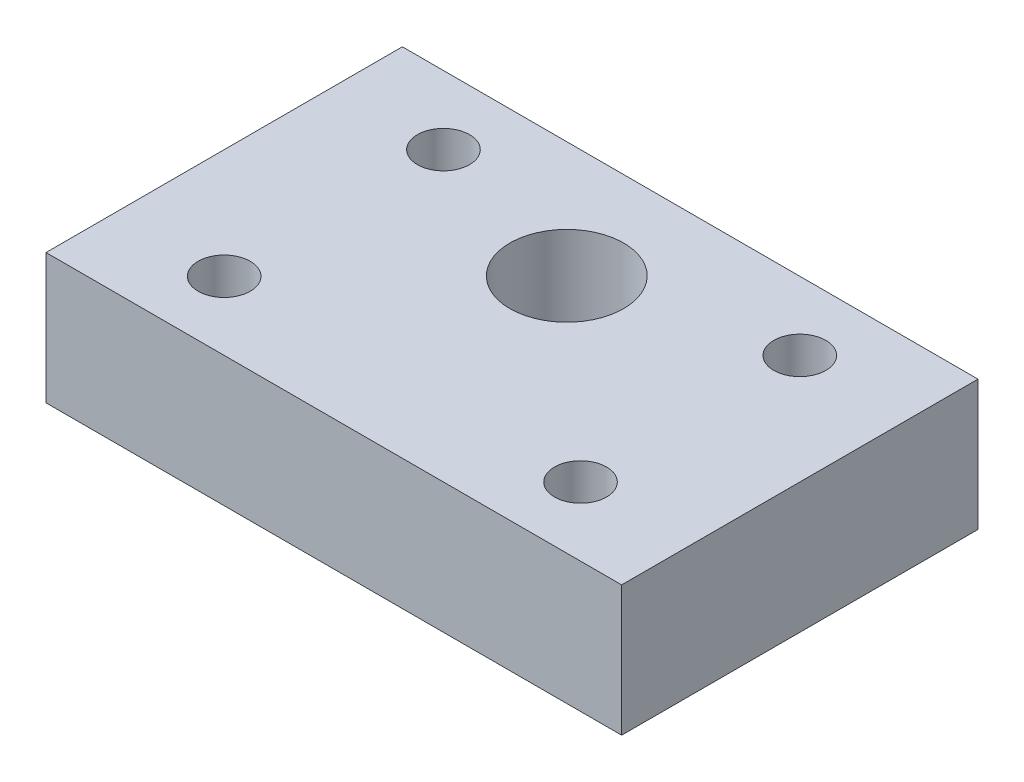
ISO-10303-21;
HEADER;
FILE_DESCRIPTION(('STEP AP214'),'2;1');
FILE_NAME('part.step','',(''),(''),'','','');
FILE_SCHEMA(('AUTOMOTIVE_DESIGN { 1 0 10303 214 1 1 1 1 }'));
ENDSEC;
DATA;
#1=APPLICATION_CONTEXT('core data for automotive mechanical design processes');
#2=APPLICATION_PROTOCOL_DEFINITION('international standard','automotive_design',2000,#1);
#3=PRODUCT_CONTEXT('',#1,'mechanical');
#4=PRODUCT('Part','Part','',(#3));
#5=PRODUCT_RELATED_PRODUCT_CATEGORY('part','',(#4));
#6=PRODUCT_DEFINITION_FORMATION('','',#4);
#7=PRODUCT_DEFINITION_CONTEXT('part definition',#1,'design');
#8=PRODUCT_DEFINITION('design','',#6,#7);
#9=PRODUCT_DEFINITION_SHAPE('','',#8);
#10=(LENGTH_UNIT() NAMED_UNIT(*) SI_UNIT(.MILLI.,.METRE.));
#11=(NAMED_UNIT(*) PLANE_ANGLE_UNIT() SI_UNIT($,.RADIAN.));
#12=(NAMED_UNIT(*) SI_UNIT($,.STERADIAN.) SOLID_ANGLE_UNIT());
#13=UNCERTAINTY_MEASURE_WITH_UNIT(LENGTH_MEASURE(1.E-05),#10,'distance_accuracy_value','');
#14=(GEOMETRIC_REPRESENTATION_CONTEXT(3) GLOBAL_UNCERTAINTY_ASSIGNED_CONTEXT((#13)) GLOBAL_UNIT_ASSIGNED_CONTEXT((#10,
#11,#12)) REPRESENTATION_CONTEXT('',''));
#15=CARTESIAN_POINT('',(0.,0.,0.));
#16=DIRECTION('',(0.,0.,1.));
#17=DIRECTION('',(1.,0.,0.));
#18=AXIS2_PLACEMENT_3D('',#15,#16,#17);
#19=CARTESIAN_POINT('',(0.,9.5,0.));
#20=DIRECTION('',(1.,0.,0.));
#21=DIRECTION('',(0.,0.,-1.));
#22=AXIS2_PLACEMENT_3D('',#19,#20,#21);
#23=PLANE('',#22);
#24=DIRECTION('',(0.,0.,1.));
#25=VECTOR('',#24,1.);
#26=CARTESIAN_POINT('',(0.,0.,0.));
#27=LINE('',#26,#25);
#28=CARTESIAN_POINT('',(0.,0.,0.));
#29=VERTEX_POINT('',#28);
#30=CARTESIAN_POINT('',(0.,0.,26.));
#31=VERTEX_POINT('',#30);
#32=EDGE_CURVE('E99',#29,#31,#27,.T.);
#33=ORIENTED_EDGE('',*,*,#32,.T.);
#34=DIRECTION('',(0.,-1.,0.));
#35=VECTOR('',#34,1.);
#36=CARTESIAN_POINT('',(0.,9.5,26.));
#37=LINE('',#36,#35);
#38=CARTESIAN_POINT('',(0.,9.5,26.));
#39=VERTEX_POINT('',#38);
#40=EDGE_CURVE('E11',#39,#31,#37,.T.);
#41=ORIENTED_EDGE('',*,*,#40,.F.);
#42=DIRECTION('',(0.,0.,1.));
#43=VECTOR('',#42,1.);
#44=CARTESIAN_POINT('',(0.,9.5,0.));
#45=LINE('',#44,#43);
#46=CARTESIAN_POINT('',(0.,9.5,0.));
#47=VERTEX_POINT('',#46);
#48=EDGE_CURVE('E87',#47,#39,#45,.T.);
#49=ORIENTED_EDGE('',*,*,#48,.F.);
#50=DIRECTION('',(0.,-1.,0.));
#51=VECTOR('',#50,1.);
#52=CARTESIAN_POINT('',(0.,9.5,0.));
#53=LINE('',#52,#51);
#54=EDGE_CURVE('E95',#47,#29,#53,.T.);
#55=ORIENTED_EDGE('',*,*,#54,.T.);
#56=EDGE_LOOP('',(#33,#41,#49,#55));
#57=FACE_BOUND('',#56,.T.);
#58=ADVANCED_FACE('F36',(#57),#23,.F.);
#59=CARTESIAN_POINT('',(0.,9.5,26.));
#60=DIRECTION('',(0.,0.,-1.));
#61=DIRECTION('',(-1.,0.,0.));
#62=AXIS2_PLACEMENT_3D('',#59,#60,#61);
#63=PLANE('',#62);
#64=DIRECTION('',(1.,0.,0.));
#65=VECTOR('',#64,1.);
#66=CARTESIAN_POINT('',(0.,0.,26.));
#67=LINE('',#66,#65);
#68=CARTESIAN_POINT('',(42.,0.,26.));
#69=VERTEX_POINT('',#68);
#70=EDGE_CURVE('E91',#31,#69,#67,.T.);
#71=ORIENTED_EDGE('',*,*,#70,.T.);
#72=DIRECTION('',(0.,-1.,0.));
#73=VECTOR('',#72,1.);
#74=CARTESIAN_POINT('',(42.,9.5,26.));
#75=LINE('',#74,#73);
#76=CARTESIAN_POINT('',(42.,9.5,26.));
#77=VERTEX_POINT('',#76);
#78=EDGE_CURVE('E44',#77,#69,#75,.T.);
#79=ORIENTED_EDGE('',*,*,#78,.F.);
#80=DIRECTION('',(1.,0.,0.));
#81=VECTOR('',#80,1.);
#82=CARTESIAN_POINT('',(0.,9.5,26.));
#83=LINE('',#82,#81);
#84=EDGE_CURVE('E82',#39,#77,#83,.T.);
#85=ORIENTED_EDGE('',*,*,#84,.F.);
#86=ORIENTED_EDGE('',*,*,#40,.T.);
#87=EDGE_LOOP('',(#71,#79,#85,#86));
#88=FACE_BOUND('',#87,.T.);
#89=ADVANCED_FACE('F90',(#88),#63,.F.);
#90=CARTESIAN_POINT('',(42.,9.5,0.));
#91=DIRECTION('',(-1.,0.,0.));
#92=DIRECTION('',(0.,0.,1.));
#93=AXIS2_PLACEMENT_3D('',#90,#91,#92);
#94=PLANE('',#93);
#95=DIRECTION('',(0.,0.,-1.));
#96=VECTOR('',#95,1.);
#97=CARTESIAN_POINT('',(42.,0.,0.));
#98=LINE('',#97,#96);
#99=CARTESIAN_POINT('',(42.,0.,0.));
#100=VERTEX_POINT('',#99);
#101=EDGE_CURVE('E69',#69,#100,#98,.T.);
#102=ORIENTED_EDGE('',*,*,#101,.T.);
#103=DIRECTION('',(0.,-1.,0.));
#104=VECTOR('',#103,1.);
#105=CARTESIAN_POINT('',(42.,9.5,0.));
#106=LINE('',#105,#104);
#107=CARTESIAN_POINT('',(42.,9.5,0.));
#108=VERTEX_POINT('',#107);
#109=EDGE_CURVE('E92',#108,#100,#106,.T.);
#110=ORIENTED_EDGE('',*,*,#109,.F.);
#111=DIRECTION('',(0.,0.,-1.));
#112=VECTOR('',#111,1.);
#113=CARTESIAN_POINT('',(42.,9.5,0.));
#114=LINE('',#113,#112);
#115=EDGE_CURVE('E85',#77,#108,#114,.T.);
#116=ORIENTED_EDGE('',*,*,#115,.F.);
#117=ORIENTED_EDGE('',*,*,#78,.T.);
#118=EDGE_LOOP('',(#102,#110,#116,#117));
#119=FACE_BOUND('',#118,.T.);
#120=ADVANCED_FACE('F93',(#119),#94,.F.);
#121=CARTESIAN_POINT('',(0.,9.5,0.));
#122=DIRECTION('',(0.,0.,1.));
#123=DIRECTION('',(1.,0.,0.));
#124=AXIS2_PLACEMENT_3D('',#121,#122,#123);
#125=PLANE('',#124);
#126=DIRECTION('',(-1.,0.,0.));
#127=VECTOR('',#126,1.);
#128=CARTESIAN_POINT('',(0.,0.,0.));
#129=LINE('',#128,#127);
#130=EDGE_CURVE('E75',#100,#29,#129,.T.);
#131=ORIENTED_EDGE('',*,*,#130,.T.);
#132=ORIENTED_EDGE('',*,*,#54,.F.);
#133=DIRECTION('',(-1.,0.,0.));
#134=VECTOR('',#133,1.);
#135=CARTESIAN_POINT('',(0.,9.5,0.));
#136=LINE('',#135,#134);
#137=EDGE_CURVE('E52',#108,#47,#136,.T.);
#138=ORIENTED_EDGE('',*,*,#137,.F.);
#139=ORIENTED_EDGE('',*,*,#109,.T.);
#140=EDGE_LOOP('',(#131,#132,#138,#139));
#141=FACE_BOUND('',#140,.T.);
#142=ADVANCED_FACE('F107',(#141),#125,.F.);
#143=CARTESIAN_POINT('',(0.,9.5,0.));
#144=DIRECTION('',(0.,1.,0.));
#145=DIRECTION('',(0.,0.,1.));
#146=AXIS2_PLACEMENT_3D('',#143,#144,#145);
#147=PLANE('',#146);
#148=CARTESIAN_POINT('',(8.,9.5,21.));
#149=DIRECTION('',(0.,1.,0.));
#150=DIRECTION('',(0.,0.,1.));
#151=AXIS2_PLACEMENT_3D('',#148,#149,#150);
#152=CIRCLE('',#151,1.9);
#153=CARTESIAN_POINT('',(8.,9.5,22.9));
#154=VERTEX_POINT('',#153);
#155=EDGE_CURVE('E132',#154,#154,#152,.T.);
#156=ORIENTED_EDGE('',*,*,#155,.F.);
#157=EDGE_LOOP('',(#156));
#158=FACE_BOUND('',#157,.T.);
#159=CARTESIAN_POINT('',(34.,9.5,5.));
#160=DIRECTION('',(0.,1.,0.));
#161=DIRECTION('',(0.,0.,1.));
#162=AXIS2_PLACEMENT_3D('',#159,#160,#161);
#163=CIRCLE('',#162,1.9);
#164=CARTESIAN_POINT('',(34.,9.5,6.9));
#165=VERTEX_POINT('',#164);
#166=EDGE_CURVE('E125',#165,#165,#163,.T.);
#167=ORIENTED_EDGE('',*,*,#166,.F.);
#168=EDGE_LOOP('',(#167));
#169=FACE_BOUND('',#168,.T.);
#170=CARTESIAN_POINT('',(34.,9.5,21.));
#171=DIRECTION('',(0.,1.,0.));
#172=DIRECTION('',(0.,0.,1.));
#173=AXIS2_PLACEMENT_3D('',#170,#171,#172);
#174=CIRCLE('',#173,1.9);
#175=CARTESIAN_POINT('',(34.,9.5,22.9));
#176=VERTEX_POINT('',#175);
#177=EDGE_CURVE('E137',#176,#176,#174,.T.);
#178=ORIENTED_EDGE('',*,*,#177,.F.);
#179=EDGE_LOOP('',(#178));
#180=FACE_BOUND('',#179,.T.);
#181=CARTESIAN_POINT('',(8.,9.5,5.));
#182=DIRECTION('',(0.,1.,0.));
#183=DIRECTION('',(0.,0.,1.));
#184=AXIS2_PLACEMENT_3D('',#181,#182,#183);
#185=CIRCLE('',#184,1.9);
#186=CARTESIAN_POINT('',(8.,9.5,6.9));
#187=VERTEX_POINT('',#186);
#188=EDGE_CURVE('E119',#187,#187,#185,.T.);
#189=ORIENTED_EDGE('',*,*,#188,.F.);
#190=EDGE_LOOP('',(#189));
#191=FACE_BOUND('',#190,.T.);
#192=CARTESIAN_POINT('',(20.4699999999959,9.5,8.47380539588607));
#193=DIRECTION('',(0.,1.,0.));
#194=DIRECTION('',(0.,0.,1.));
#195=AXIS2_PLACEMENT_3D('',#192,#193,#194);
#196=CIRCLE('',#195,4.15);
#197=CARTESIAN_POINT('',(20.4699999999959,9.5,12.6238053958861));
#198=VERTEX_POINT('',#197);
#199=EDGE_CURVE('E113',#198,#198,#196,.T.);
#200=ORIENTED_EDGE('',*,*,#199,.F.);
#201=EDGE_LOOP('',(#200));
#202=FACE_BOUND('',#201,.T.);
#203=ORIENTED_EDGE('',*,*,#48,.T.);
#204=ORIENTED_EDGE('',*,*,#84,.T.);
#205=ORIENTED_EDGE('',*,*,#115,.T.);
#206=ORIENTED_EDGE('',*,*,#137,.T.);
#207=EDGE_LOOP('',(#203,#204,#205,#206));
#208=FACE_BOUND('',#207,.T.);
#209=ADVANCED_FACE('F83',(#158,#169,#180,#191,#202,#208),#147,.T.);
#210=CARTESIAN_POINT('',(0.,0.,0.));
#211=DIRECTION('',(0.,1.,0.));
#212=DIRECTION('',(0.,0.,1.));
#213=AXIS2_PLACEMENT_3D('',#210,#211,#212);
#214=PLANE('',#213);
#215=CARTESIAN_POINT('',(8.,0.,21.));
#216=DIRECTION('',(0.,1.,0.));
#217=DIRECTION('',(0.,0.,1.));
#218=AXIS2_PLACEMENT_3D('',#215,#216,#217);
#219=CIRCLE('',#218,1.9);
#220=CARTESIAN_POINT('',(8.,0.,22.9));
#221=VERTEX_POINT('',#220);
#222=EDGE_CURVE('E122',#221,#221,#219,.T.);
#223=ORIENTED_EDGE('',*,*,#222,.T.);
#224=EDGE_LOOP('',(#223));
#225=FACE_BOUND('',#224,.T.);
#226=CARTESIAN_POINT('',(34.,0.,5.));
#227=DIRECTION('',(0.,1.,0.));
#228=DIRECTION('',(0.,0.,1.));
#229=AXIS2_PLACEMENT_3D('',#226,#227,#228);
#230=CIRCLE('',#229,1.9);
#231=CARTESIAN_POINT('',(34.,0.,6.9));
#232=VERTEX_POINT('',#231);
#233=EDGE_CURVE('E128',#232,#232,#230,.T.);
#234=ORIENTED_EDGE('',*,*,#233,.T.);
#235=EDGE_LOOP('',(#234));
#236=FACE_BOUND('',#235,.T.);
#237=CARTESIAN_POINT('',(34.,0.,21.));
#238=DIRECTION('',(0.,1.,0.));
#239=DIRECTION('',(0.,0.,1.));
#240=AXIS2_PLACEMENT_3D('',#237,#238,#239);
#241=CIRCLE('',#240,1.9);
#242=CARTESIAN_POINT('',(34.,0.,22.9));
#243=VERTEX_POINT('',#242);
#244=EDGE_CURVE('E129',#243,#243,#241,.T.);
#245=ORIENTED_EDGE('',*,*,#244,.T.);
#246=EDGE_LOOP('',(#245));
#247=FACE_BOUND('',#246,.T.);
#248=CARTESIAN_POINT('',(8.,0.,5.));
#249=DIRECTION('',(0.,1.,0.));
#250=DIRECTION('',(0.,0.,1.));
#251=AXIS2_PLACEMENT_3D('',#248,#249,#250);
#252=CIRCLE('',#251,1.9);
#253=CARTESIAN_POINT('',(8.,0.,6.9));
#254=VERTEX_POINT('',#253);
#255=EDGE_CURVE('E116',#254,#254,#252,.T.);
#256=ORIENTED_EDGE('',*,*,#255,.T.);
#257=EDGE_LOOP('',(#256));
#258=FACE_BOUND('',#257,.T.);
#259=CARTESIAN_POINT('',(20.4699999999959,0.,8.47380539588607));
#260=DIRECTION('',(0.,1.,0.));
#261=DIRECTION('',(0.,0.,1.));
#262=AXIS2_PLACEMENT_3D('',#259,#260,#261);
#263=CIRCLE('',#262,4.15);
#264=CARTESIAN_POINT('',(20.4699999999959,0.,12.6238053958861));
#265=VERTEX_POINT('',#264);
#266=EDGE_CURVE('E102',#265,#265,#263,.T.);
#267=ORIENTED_EDGE('',*,*,#266,.T.);
#268=EDGE_LOOP('',(#267));
#269=FACE_BOUND('',#268,.T.);
#270=ORIENTED_EDGE('',*,*,#32,.F.);
#271=ORIENTED_EDGE('',*,*,#130,.F.);
#272=ORIENTED_EDGE('',*,*,#101,.F.);
#273=ORIENTED_EDGE('',*,*,#70,.F.);
#274=EDGE_LOOP('',(#270,#271,#272,#273));
#275=FACE_BOUND('',#274,.T.);
#276=ADVANCED_FACE('F110',(#225,#236,#247,#258,#269,#275),#214,.F.);
#277=CARTESIAN_POINT('',(20.4699999999959,0.,8.47380539588607));
#278=DIRECTION('',(0.,1.,0.));
#279=DIRECTION('',(0.,0.,1.));
#280=AXIS2_PLACEMENT_3D('',#277,#278,#279);
#281=CYLINDRICAL_SURFACE('',#280,4.15);
#282=ORIENTED_EDGE('',*,*,#266,.F.);
#283=EDGE_LOOP('',(#282));
#284=FACE_BOUND('',#283,.T.);
#285=ORIENTED_EDGE('',*,*,#199,.T.);
#286=EDGE_LOOP('',(#285));
#287=FACE_BOUND('',#286,.T.);
#288=ADVANCED_FACE('F161',(#284,#287),#281,.F.);
#289=CARTESIAN_POINT('',(8.,0.,5.));
#290=DIRECTION('',(0.,1.,0.));
#291=DIRECTION('',(0.,0.,1.));
#292=AXIS2_PLACEMENT_3D('',#289,#290,#291);
#293=CYLINDRICAL_SURFACE('',#292,1.9);
#294=ORIENTED_EDGE('',*,*,#255,.F.);
#295=EDGE_LOOP('',(#294));
#296=FACE_BOUND('',#295,.T.);
#297=ORIENTED_EDGE('',*,*,#188,.T.);
#298=EDGE_LOOP('',(#297));
#299=FACE_BOUND('',#298,.T.);
#300=ADVANCED_FACE('F149',(#296,#299),#293,.F.);
#301=CARTESIAN_POINT('',(34.,0.,21.));
#302=DIRECTION('',(0.,1.,0.));
#303=DIRECTION('',(0.,0.,1.));
#304=AXIS2_PLACEMENT_3D('',#301,#302,#303);
#305=CYLINDRICAL_SURFACE('',#304,1.9);
#306=ORIENTED_EDGE('',*,*,#244,.F.);
#307=EDGE_LOOP('',(#306));
#308=FACE_BOUND('',#307,.T.);
#309=ORIENTED_EDGE('',*,*,#177,.T.);
#310=EDGE_LOOP('',(#309));
#311=FACE_BOUND('',#310,.T.);
#312=ADVANCED_FACE('F145',(#308,#311),#305,.F.);
#313=CARTESIAN_POINT('',(34.,0.,5.));
#314=DIRECTION('',(0.,1.,0.));
#315=DIRECTION('',(0.,0.,1.));
#316=AXIS2_PLACEMENT_3D('',#313,#314,#315);
#317=CYLINDRICAL_SURFACE('',#316,1.9);
#318=ORIENTED_EDGE('',*,*,#233,.F.);
#319=EDGE_LOOP('',(#318));
#320=FACE_BOUND('',#319,.T.);
#321=ORIENTED_EDGE('',*,*,#166,.T.);
#322=EDGE_LOOP('',(#321));
#323=FACE_BOUND('',#322,.T.);
#324=ADVANCED_FACE('F148',(#320,#323),#317,.F.);
#325=CARTESIAN_POINT('',(8.,0.,21.));
#326=DIRECTION('',(0.,1.,0.));
#327=DIRECTION('',(0.,0.,1.));
#328=AXIS2_PLACEMENT_3D('',#325,#326,#327);
#329=CYLINDRICAL_SURFACE('',#328,1.9);
#330=ORIENTED_EDGE('',*,*,#222,.F.);
#331=EDGE_LOOP('',(#330));
#332=FACE_BOUND('',#331,.T.);
#333=ORIENTED_EDGE('',*,*,#155,.T.);
#334=EDGE_LOOP('',(#333));
#335=FACE_BOUND('',#334,.T.);
#336=ADVANCED_FACE('F220',(#332,#335),#329,.F.);
#337=CLOSED_SHELL('',(#58,#89,#120,#142,#209,#276,#288,#300,#312,#324,#336));
#338=MANIFOLD_SOLID_BREP('B2',#337);
#339=ADVANCED_BREP_SHAPE_REPRESENTATION('',(#18,#338),#14);
#340=SHAPE_DEFINITION_REPRESENTATION(#9,#339);
ENDSEC;
END-ISO-10303-21;
